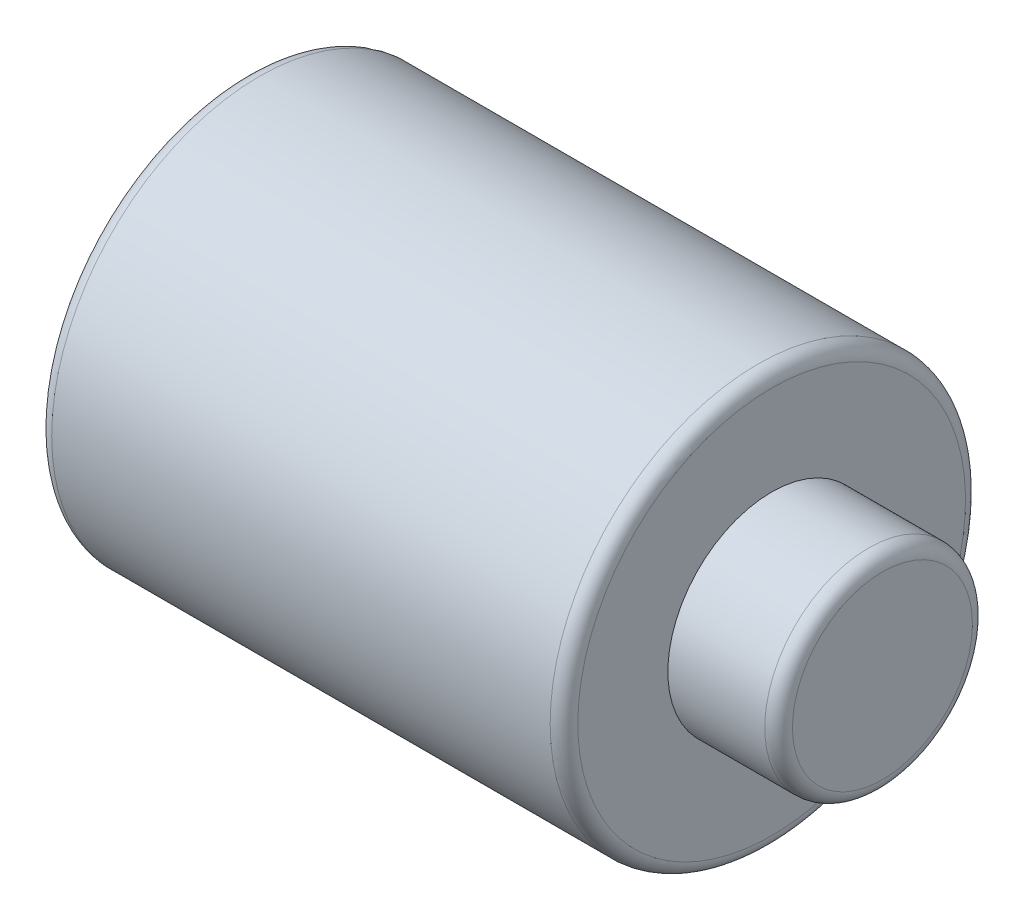
ISO-10303-21;
HEADER;
FILE_DESCRIPTION(('STEP AP214'),'2;1');
FILE_NAME('part.step','',(''),(''),'','','');
FILE_SCHEMA(('AUTOMOTIVE_DESIGN { 1 0 10303 214 1 1 1 1 }'));
ENDSEC;
DATA;
#1=APPLICATION_CONTEXT('core data for automotive mechanical design processes');
#2=APPLICATION_PROTOCOL_DEFINITION('international standard','automotive_design',2000,#1);
#3=PRODUCT_CONTEXT('',#1,'mechanical');
#4=PRODUCT('Part','Part','',(#3));
#5=PRODUCT_RELATED_PRODUCT_CATEGORY('part','',(#4));
#6=PRODUCT_DEFINITION_FORMATION('','',#4);
#7=PRODUCT_DEFINITION_CONTEXT('part definition',#1,'design');
#8=PRODUCT_DEFINITION('design','',#6,#7);
#9=PRODUCT_DEFINITION_SHAPE('','',#8);
#10=(LENGTH_UNIT() NAMED_UNIT(*) SI_UNIT(.MILLI.,.METRE.));
#11=(NAMED_UNIT(*) PLANE_ANGLE_UNIT() SI_UNIT($,.RADIAN.));
#12=(NAMED_UNIT(*) SI_UNIT($,.STERADIAN.) SOLID_ANGLE_UNIT());
#13=UNCERTAINTY_MEASURE_WITH_UNIT(LENGTH_MEASURE(1.E-05),#10,'distance_accuracy_value','');
#14=(GEOMETRIC_REPRESENTATION_CONTEXT(3) GLOBAL_UNCERTAINTY_ASSIGNED_CONTEXT((#13)) GLOBAL_UNIT_ASSIGNED_CONTEXT((#10,
#11,#12)) REPRESENTATION_CONTEXT('',''));
#15=CARTESIAN_POINT('',(0.,0.,0.));
#16=DIRECTION('',(0.,0.,1.));
#17=DIRECTION('',(1.,0.,0.));
#18=AXIS2_PLACEMENT_3D('',#15,#16,#17);
#19=CARTESIAN_POINT('',(0.,0.,0.));
#20=DIRECTION('',(-1.,0.,0.));
#21=DIRECTION('',(0.,-1.,0.));
#22=AXIS2_PLACEMENT_3D('',#19,#20,#21);
#23=PLANE('',#22);
#24=CARTESIAN_POINT('',(0.,0.,0.));
#25=DIRECTION('',(-1.,0.,0.));
#26=DIRECTION('',(0.,-1.,0.));
#27=AXIS2_PLACEMENT_3D('',#24,#25,#26);
#28=CIRCLE('',#27,14.);
#29=CARTESIAN_POINT('',(0.,-14.,0.));
#30=VERTEX_POINT('',#29);
#31=EDGE_CURVE('E43',#30,#30,#28,.T.);
#32=ORIENTED_EDGE('',*,*,#31,.T.);
#33=EDGE_LOOP('',(#32));
#34=FACE_BOUND('',#33,.T.);
#35=CARTESIAN_POINT('',(0.,0.,0.));
#36=DIRECTION('',(-1.,0.,0.));
#37=DIRECTION('',(0.,-1.,0.));
#38=AXIS2_PLACEMENT_3D('',#35,#36,#37);
#39=CIRCLE('',#38,4.25);
#40=CARTESIAN_POINT('',(0.,-4.25,0.));
#41=VERTEX_POINT('',#40);
#42=EDGE_CURVE('E66',#41,#41,#39,.T.);
#43=ORIENTED_EDGE('',*,*,#42,.F.);
#44=EDGE_LOOP('',(#43));
#45=FACE_BOUND('',#44,.T.);
#46=ADVANCED_FACE('F36',(#34,#45),#23,.T.);
#47=CARTESIAN_POINT('',(46.,0.,0.));
#48=DIRECTION('',(1.,0.,0.));
#49=DIRECTION('',(0.,1.,0.));
#50=AXIS2_PLACEMENT_3D('',#47,#48,#49);
#51=CYLINDRICAL_SURFACE('',#50,15.);
#52=CARTESIAN_POINT('',(1.,0.,0.));
#53=DIRECTION('',(-1.,0.,0.));
#54=DIRECTION('',(0.,-1.,0.));
#55=AXIS2_PLACEMENT_3D('',#52,#53,#54);
#56=CIRCLE('',#55,15.);
#57=CARTESIAN_POINT('',(1.,-15.,0.));
#58=VERTEX_POINT('',#57);
#59=EDGE_CURVE('E47',#58,#58,#56,.F.);
#60=ORIENTED_EDGE('',*,*,#59,.T.);
#61=EDGE_LOOP('',(#60));
#62=FACE_BOUND('',#61,.T.);
#63=CARTESIAN_POINT('',(37.,0.,0.));
#64=DIRECTION('',(1.,0.,0.));
#65=DIRECTION('',(0.,1.,0.));
#66=AXIS2_PLACEMENT_3D('',#63,#64,#65);
#67=CIRCLE('',#66,15.);
#68=CARTESIAN_POINT('',(37.,15.,0.));
#69=VERTEX_POINT('',#68);
#70=EDGE_CURVE('E51',#69,#69,#67,.F.);
#71=ORIENTED_EDGE('',*,*,#70,.T.);
#72=EDGE_LOOP('',(#71));
#73=FACE_BOUND('',#72,.T.);
#74=ADVANCED_FACE('F82',(#62,#73),#51,.T.);
#75=CARTESIAN_POINT('',(38.,15.,0.));
#76=DIRECTION('',(1.,0.,0.));
#77=DIRECTION('',(0.,1.,0.));
#78=AXIS2_PLACEMENT_3D('',#75,#76,#77);
#79=PLANE('',#78);
#80=CARTESIAN_POINT('',(38.,0.,0.));
#81=DIRECTION('',(1.,0.,0.));
#82=DIRECTION('',(0.,1.,0.));
#83=AXIS2_PLACEMENT_3D('',#80,#81,#82);
#84=CIRCLE('',#83,14.);
#85=CARTESIAN_POINT('',(38.,14.,0.));
#86=VERTEX_POINT('',#85);
#87=EDGE_CURVE('E10',#86,#86,#84,.T.);
#88=ORIENTED_EDGE('',*,*,#87,.T.);
#89=EDGE_LOOP('',(#88));
#90=FACE_BOUND('',#89,.T.);
#91=CARTESIAN_POINT('',(38.,0.,0.));
#92=DIRECTION('',(1.,0.,0.));
#93=DIRECTION('',(0.,1.,0.));
#94=AXIS2_PLACEMENT_3D('',#91,#92,#93);
#95=CIRCLE('',#94,7.5);
#96=CARTESIAN_POINT('',(38.,7.50000000000001,0.));
#97=VERTEX_POINT('',#96);
#98=EDGE_CURVE('E62',#97,#97,#95,.T.);
#99=ORIENTED_EDGE('',*,*,#98,.F.);
#100=EDGE_LOOP('',(#99));
#101=FACE_BOUND('',#100,.T.);
#102=ADVANCED_FACE('F87',(#90,#101),#79,.T.);
#103=CARTESIAN_POINT('',(46.,0.,0.));
#104=DIRECTION('',(1.,0.,0.));
#105=DIRECTION('',(0.,1.,0.));
#106=AXIS2_PLACEMENT_3D('',#103,#104,#105);
#107=CYLINDRICAL_SURFACE('',#106,7.5);
#108=CARTESIAN_POINT('',(45.,0.,0.));
#109=DIRECTION('',(1.,0.,0.));
#110=DIRECTION('',(0.,1.,0.));
#111=AXIS2_PLACEMENT_3D('',#108,#109,#110);
#112=CIRCLE('',#111,7.5);
#113=CARTESIAN_POINT('',(45.,7.50000000000001,0.));
#114=VERTEX_POINT('',#113);
#115=EDGE_CURVE('E56',#114,#114,#112,.F.);
#116=ORIENTED_EDGE('',*,*,#115,.T.);
#117=EDGE_LOOP('',(#116));
#118=FACE_BOUND('',#117,.T.);
#119=ORIENTED_EDGE('',*,*,#98,.T.);
#120=EDGE_LOOP('',(#119));
#121=FACE_BOUND('',#120,.T.);
#122=ADVANCED_FACE('F130',(#118,#121),#107,.T.);
#123=CARTESIAN_POINT('',(46.,7.50000000000001,0.));
#124=DIRECTION('',(1.,0.,0.));
#125=DIRECTION('',(0.,1.,0.));
#126=AXIS2_PLACEMENT_3D('',#123,#124,#125);
#127=PLANE('',#126);
#128=CARTESIAN_POINT('',(46.,0.,0.));
#129=DIRECTION('',(1.,0.,0.));
#130=DIRECTION('',(0.,1.,0.));
#131=AXIS2_PLACEMENT_3D('',#128,#129,#130);
#132=CIRCLE('',#131,6.5);
#133=CARTESIAN_POINT('',(46.,6.50000000000001,0.));
#134=VERTEX_POINT('',#133);
#135=EDGE_CURVE('E59',#134,#134,#132,.T.);
#136=ORIENTED_EDGE('',*,*,#135,.T.);
#137=EDGE_LOOP('',(#136));
#138=FACE_BOUND('',#137,.T.);
#139=ADVANCED_FACE('F77',(#138),#127,.T.);
#140=CARTESIAN_POINT('',(30.,0.,0.));
#141=DIRECTION('',(-1.,0.,0.));
#142=DIRECTION('',(0.,-1.,0.));
#143=AXIS2_PLACEMENT_3D('',#140,#141,#142);
#144=CYLINDRICAL_SURFACE('',#143,4.25);
#145=CARTESIAN_POINT('',(30.,0.,0.));
#146=DIRECTION('',(-1.,0.,0.));
#147=DIRECTION('',(0.,-1.,0.));
#148=AXIS2_PLACEMENT_3D('',#145,#146,#147);
#149=CIRCLE('',#148,4.25);
#150=CARTESIAN_POINT('',(30.,-4.25,0.));
#151=VERTEX_POINT('',#150);
#152=EDGE_CURVE('E65',#151,#151,#149,.T.);
#153=ORIENTED_EDGE('',*,*,#152,.F.);
#154=EDGE_LOOP('',(#153));
#155=FACE_BOUND('',#154,.T.);
#156=ORIENTED_EDGE('',*,*,#42,.T.);
#157=EDGE_LOOP('',(#156));
#158=FACE_BOUND('',#157,.T.);
#159=ADVANCED_FACE('F74',(#155,#158),#144,.F.);
#160=CARTESIAN_POINT('',(30.,0.,0.));
#161=DIRECTION('',(-1.,0.,0.));
#162=DIRECTION('',(0.,-1.,0.));
#163=AXIS2_PLACEMENT_3D('',#160,#161,#162);
#164=PLANE('',#163);
#165=ORIENTED_EDGE('',*,*,#152,.T.);
#166=EDGE_LOOP('',(#165));
#167=FACE_BOUND('',#166,.T.);
#168=ADVANCED_FACE('F72',(#167),#164,.T.);
#169=CARTESIAN_POINT('',(45.,0.,0.));
#170=DIRECTION('',(1.,0.,0.));
#171=DIRECTION('',(0.,1.,0.));
#172=AXIS2_PLACEMENT_3D('',#169,#170,#171);
#173=TOROIDAL_SURFACE('',#172,6.5,1.);
#174=ORIENTED_EDGE('',*,*,#115,.F.);
#175=EDGE_LOOP('',(#174));
#176=FACE_BOUND('',#175,.T.);
#177=ORIENTED_EDGE('',*,*,#135,.F.);
#178=EDGE_LOOP('',(#177));
#179=FACE_BOUND('',#178,.T.);
#180=ADVANCED_FACE('F92',(#176,#179),#173,.T.);
#181=CARTESIAN_POINT('',(1.,0.,0.));
#182=DIRECTION('',(-1.,0.,0.));
#183=DIRECTION('',(0.,-1.,0.));
#184=AXIS2_PLACEMENT_3D('',#181,#182,#183);
#185=TOROIDAL_SURFACE('',#184,14.,1.);
#186=ORIENTED_EDGE('',*,*,#31,.F.);
#187=EDGE_LOOP('',(#186));
#188=FACE_BOUND('',#187,.T.);
#189=ORIENTED_EDGE('',*,*,#59,.F.);
#190=EDGE_LOOP('',(#189));
#191=FACE_BOUND('',#190,.T.);
#192=ADVANCED_FACE('F94',(#188,#191),#185,.T.);
#193=CARTESIAN_POINT('',(37.,0.,0.));
#194=DIRECTION('',(1.,0.,0.));
#195=DIRECTION('',(0.,1.,0.));
#196=AXIS2_PLACEMENT_3D('',#193,#194,#195);
#197=TOROIDAL_SURFACE('',#196,14.,1.);
#198=ORIENTED_EDGE('',*,*,#70,.F.);
#199=EDGE_LOOP('',(#198));
#200=FACE_BOUND('',#199,.T.);
#201=ORIENTED_EDGE('',*,*,#87,.F.);
#202=EDGE_LOOP('',(#201));
#203=FACE_BOUND('',#202,.T.);
#204=ADVANCED_FACE('F38',(#200,#203),#197,.T.);
#205=CLOSED_SHELL('',(#46,#74,#102,#122,#139,#159,#168,#180,#192,#204));
#206=MANIFOLD_SOLID_BREP('B2',#205);
#207=ADVANCED_BREP_SHAPE_REPRESENTATION('',(#18,#206),#14);
#208=SHAPE_DEFINITION_REPRESENTATION(#9,#207);
ENDSEC;
END-ISO-10303-21;
